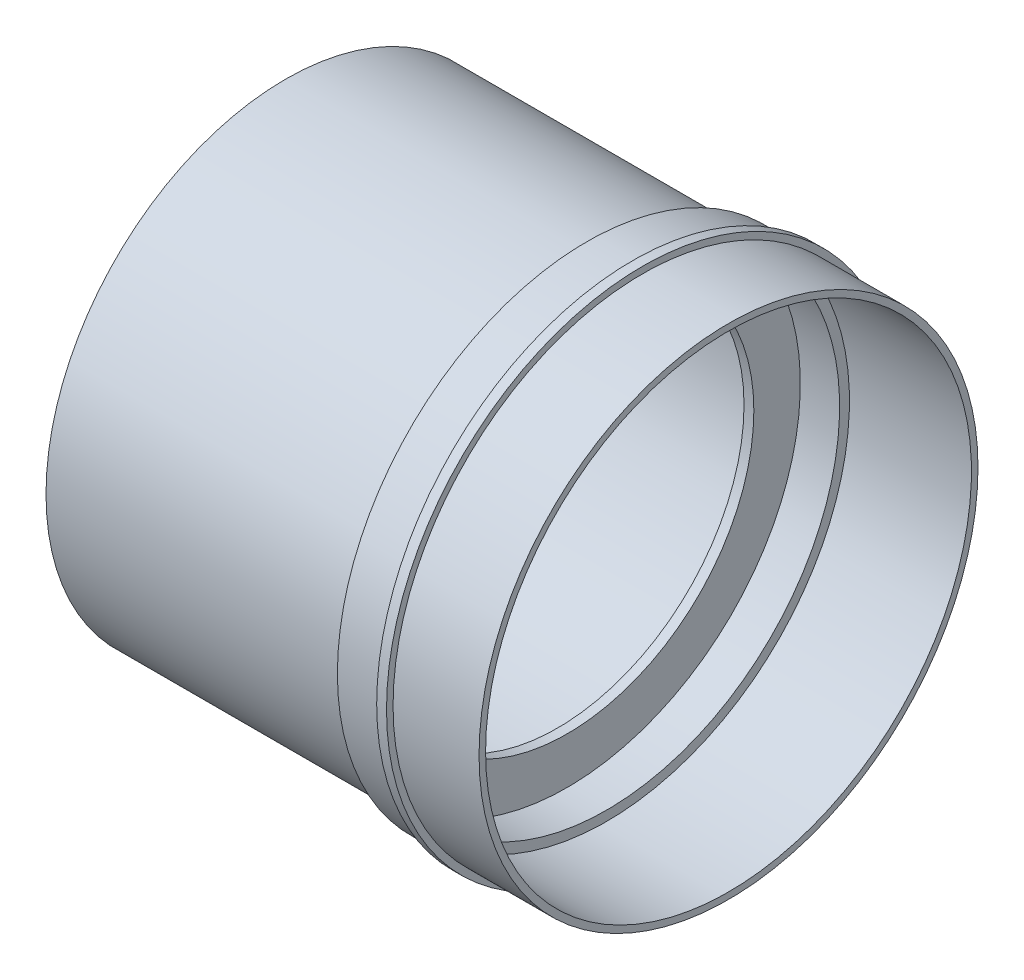
ISO-10303-21;
HEADER;
FILE_DESCRIPTION(('STEP AP214'),'2;1');
FILE_NAME('part.step','',(''),(''),'','','');
FILE_SCHEMA(('AUTOMOTIVE_DESIGN { 1 0 10303 214 1 1 1 1 }'));
ENDSEC;
DATA;
#1=APPLICATION_CONTEXT('core data for automotive mechanical design processes');
#2=APPLICATION_PROTOCOL_DEFINITION('international standard','automotive_design',2000,#1);
#3=PRODUCT_CONTEXT('',#1,'mechanical');
#4=PRODUCT('Part','Part','',(#3));
#5=PRODUCT_RELATED_PRODUCT_CATEGORY('part','',(#4));
#6=PRODUCT_DEFINITION_FORMATION('','',#4);
#7=PRODUCT_DEFINITION_CONTEXT('part definition',#1,'design');
#8=PRODUCT_DEFINITION('design','',#6,#7);
#9=PRODUCT_DEFINITION_SHAPE('','',#8);
#10=(LENGTH_UNIT() NAMED_UNIT(*) SI_UNIT(.MILLI.,.METRE.));
#11=(NAMED_UNIT(*) PLANE_ANGLE_UNIT() SI_UNIT($,.RADIAN.));
#12=(NAMED_UNIT(*) SI_UNIT($,.STERADIAN.) SOLID_ANGLE_UNIT());
#13=UNCERTAINTY_MEASURE_WITH_UNIT(LENGTH_MEASURE(1.E-05),#10,'distance_accuracy_value','');
#14=(GEOMETRIC_REPRESENTATION_CONTEXT(3) GLOBAL_UNCERTAINTY_ASSIGNED_CONTEXT((#13)) GLOBAL_UNIT_ASSIGNED_CONTEXT((#10,
#11,#12)) REPRESENTATION_CONTEXT('',''));
#15=CARTESIAN_POINT('',(0.,0.,0.));
#16=DIRECTION('',(0.,0.,1.));
#17=DIRECTION('',(1.,0.,0.));
#18=AXIS2_PLACEMENT_3D('',#15,#16,#17);
#19=CARTESIAN_POINT('',(-83.,73.2,0.));
#20=DIRECTION('',(1.,0.,0.));
#21=DIRECTION('',(0.,0.,-1.));
#22=AXIS2_PLACEMENT_3D('',#19,#20,#21);
#23=PLANE('',#22);
#24=CARTESIAN_POINT('',(-83.,0.,0.));
#25=DIRECTION('',(-1.,0.,0.));
#26=DIRECTION('',(0.,0.,1.));
#27=AXIS2_PLACEMENT_3D('',#24,#25,#26);
#28=CIRCLE('',#27,71.2);
#29=CARTESIAN_POINT('',(-83.,0.,71.2));
#30=VERTEX_POINT('',#29);
#31=EDGE_CURVE('E10',#30,#30,#28,.T.);
#32=ORIENTED_EDGE('',*,*,#31,.F.);
#33=EDGE_LOOP('',(#32));
#34=FACE_BOUND('',#33,.T.);
#35=CARTESIAN_POINT('',(-83.,0.,0.));
#36=DIRECTION('',(-1.,0.,0.));
#37=DIRECTION('',(0.,0.,1.));
#38=AXIS2_PLACEMENT_3D('',#35,#36,#37);
#39=CIRCLE('',#38,73.2);
#40=CARTESIAN_POINT('',(-83.,0.,73.2));
#41=VERTEX_POINT('',#40);
#42=EDGE_CURVE('E87',#41,#41,#39,.T.);
#43=ORIENTED_EDGE('',*,*,#42,.T.);
#44=EDGE_LOOP('',(#43));
#45=FACE_BOUND('',#44,.T.);
#46=ADVANCED_FACE('F35',(#34,#45),#23,.F.);
#47=CARTESIAN_POINT('',(-34.473771286316,0.,0.));
#48=DIRECTION('',(-1.,0.,0.));
#49=DIRECTION('',(0.,0.,1.));
#50=AXIS2_PLACEMENT_3D('',#47,#48,#49);
#51=CYLINDRICAL_SURFACE('',#50,71.2);
#52=CARTESIAN_POINT('',(0.,0.,0.));
#53=DIRECTION('',(-1.,0.,0.));
#54=DIRECTION('',(0.,0.,1.));
#55=AXIS2_PLACEMENT_3D('',#52,#53,#54);
#56=CIRCLE('',#55,71.2);
#57=CARTESIAN_POINT('',(0.,0.,71.2));
#58=VERTEX_POINT('',#57);
#59=EDGE_CURVE('E41',#58,#58,#56,.T.);
#60=ORIENTED_EDGE('',*,*,#59,.F.);
#61=EDGE_LOOP('',(#60));
#62=FACE_BOUND('',#61,.T.);
#63=ORIENTED_EDGE('',*,*,#31,.T.);
#64=EDGE_LOOP('',(#63));
#65=FACE_BOUND('',#64,.T.);
#66=ADVANCED_FACE('F172',(#62,#65),#51,.F.);
#67=CARTESIAN_POINT('',(0.,71.2,0.));
#68=DIRECTION('',(1.,0.,0.));
#69=DIRECTION('',(0.,0.,-1.));
#70=AXIS2_PLACEMENT_3D('',#67,#68,#69);
#71=PLANE('',#70);
#72=CARTESIAN_POINT('',(0.,0.,0.));
#73=DIRECTION('',(-1.,0.,0.));
#74=DIRECTION('',(0.,0.,1.));
#75=AXIS2_PLACEMENT_3D('',#72,#73,#74);
#76=CIRCLE('',#75,57.);
#77=CARTESIAN_POINT('',(0.,0.,57.));
#78=VERTEX_POINT('',#77);
#79=EDGE_CURVE('E45',#78,#78,#76,.T.);
#80=ORIENTED_EDGE('',*,*,#79,.F.);
#81=EDGE_LOOP('',(#80));
#82=FACE_BOUND('',#81,.T.);
#83=ORIENTED_EDGE('',*,*,#59,.T.);
#84=EDGE_LOOP('',(#83));
#85=FACE_BOUND('',#84,.T.);
#86=ADVANCED_FACE('F167',(#82,#85),#71,.F.);
#87=CARTESIAN_POINT('',(-34.473771286316,0.,0.));
#88=DIRECTION('',(-1.,0.,0.));
#89=DIRECTION('',(0.,0.,1.));
#90=AXIS2_PLACEMENT_3D('',#87,#88,#89);
#91=CYLINDRICAL_SURFACE('',#90,57.);
#92=CARTESIAN_POINT('',(3.,0.,0.));
#93=DIRECTION('',(-1.,0.,0.));
#94=DIRECTION('',(0.,0.,1.));
#95=AXIS2_PLACEMENT_3D('',#92,#93,#94);
#96=CIRCLE('',#95,57.);
#97=CARTESIAN_POINT('',(3.,0.,57.));
#98=VERTEX_POINT('',#97);
#99=EDGE_CURVE('E49',#98,#98,#96,.T.);
#100=ORIENTED_EDGE('',*,*,#99,.F.);
#101=EDGE_LOOP('',(#100));
#102=FACE_BOUND('',#101,.T.);
#103=ORIENTED_EDGE('',*,*,#79,.T.);
#104=EDGE_LOOP('',(#103));
#105=FACE_BOUND('',#104,.T.);
#106=ADVANCED_FACE('F161',(#102,#105),#91,.F.);
#107=CARTESIAN_POINT('',(2.99999999999999,71.2,0.));
#108=DIRECTION('',(-1.,0.,0.));
#109=DIRECTION('',(0.,0.,1.));
#110=AXIS2_PLACEMENT_3D('',#107,#108,#109);
#111=PLANE('',#110);
#112=CARTESIAN_POINT('',(2.99999999999999,0.,0.));
#113=DIRECTION('',(-1.,0.,0.));
#114=DIRECTION('',(0.,0.,1.));
#115=AXIS2_PLACEMENT_3D('',#112,#113,#114);
#116=CIRCLE('',#115,71.2);
#117=CARTESIAN_POINT('',(2.99999999999999,0.,71.2));
#118=VERTEX_POINT('',#117);
#119=EDGE_CURVE('E54',#118,#118,#116,.T.);
#120=ORIENTED_EDGE('',*,*,#119,.F.);
#121=EDGE_LOOP('',(#120));
#122=FACE_BOUND('',#121,.T.);
#123=ORIENTED_EDGE('',*,*,#99,.T.);
#124=EDGE_LOOP('',(#123));
#125=FACE_BOUND('',#124,.T.);
#126=ADVANCED_FACE('F155',(#122,#125),#111,.F.);
#127=CARTESIAN_POINT('',(-34.473771286316,0.,0.));
#128=DIRECTION('',(-1.,0.,0.));
#129=DIRECTION('',(0.,0.,1.));
#130=AXIS2_PLACEMENT_3D('',#127,#128,#129);
#131=CYLINDRICAL_SURFACE('',#130,71.2);
#132=CARTESIAN_POINT('',(15.,0.,0.));
#133=DIRECTION('',(-1.,0.,0.));
#134=DIRECTION('',(0.,0.,1.));
#135=AXIS2_PLACEMENT_3D('',#132,#133,#134);
#136=CIRCLE('',#135,71.2);
#137=CARTESIAN_POINT('',(15.,0.,71.2));
#138=VERTEX_POINT('',#137);
#139=EDGE_CURVE('E57',#138,#138,#136,.T.);
#140=ORIENTED_EDGE('',*,*,#139,.F.);
#141=EDGE_LOOP('',(#140));
#142=FACE_BOUND('',#141,.T.);
#143=ORIENTED_EDGE('',*,*,#119,.T.);
#144=EDGE_LOOP('',(#143));
#145=FACE_BOUND('',#144,.T.);
#146=ADVANCED_FACE('F149',(#142,#145),#131,.F.);
#147=CARTESIAN_POINT('',(15.,74.2,0.));
#148=DIRECTION('',(-1.,0.,0.));
#149=DIRECTION('',(0.,0.,1.));
#150=AXIS2_PLACEMENT_3D('',#147,#148,#149);
#151=PLANE('',#150);
#152=CARTESIAN_POINT('',(15.,0.,0.));
#153=DIRECTION('',(-1.,0.,0.));
#154=DIRECTION('',(0.,0.,1.));
#155=AXIS2_PLACEMENT_3D('',#152,#153,#154);
#156=CIRCLE('',#155,74.2);
#157=CARTESIAN_POINT('',(15.,0.,74.2));
#158=VERTEX_POINT('',#157);
#159=EDGE_CURVE('E60',#158,#158,#156,.T.);
#160=ORIENTED_EDGE('',*,*,#159,.F.);
#161=EDGE_LOOP('',(#160));
#162=FACE_BOUND('',#161,.T.);
#163=ORIENTED_EDGE('',*,*,#139,.T.);
#164=EDGE_LOOP('',(#163));
#165=FACE_BOUND('',#164,.T.);
#166=ADVANCED_FACE('F143',(#162,#165),#151,.F.);
#167=CARTESIAN_POINT('',(-34.473771286316,0.,0.));
#168=DIRECTION('',(-1.,0.,0.));
#169=DIRECTION('',(0.,0.,1.));
#170=AXIS2_PLACEMENT_3D('',#167,#168,#169);
#171=CYLINDRICAL_SURFACE('',#170,74.2);
#172=CARTESIAN_POINT('',(52.2635418509648,0.,0.));
#173=DIRECTION('',(-1.,0.,0.));
#174=DIRECTION('',(0.,0.,1.));
#175=AXIS2_PLACEMENT_3D('',#172,#173,#174);
#176=CIRCLE('',#175,74.2);
#177=CARTESIAN_POINT('',(52.2635418509648,0.,74.2));
#178=VERTEX_POINT('',#177);
#179=EDGE_CURVE('E63',#178,#178,#176,.T.);
#180=ORIENTED_EDGE('',*,*,#179,.F.);
#181=EDGE_LOOP('',(#180));
#182=FACE_BOUND('',#181,.T.);
#183=ORIENTED_EDGE('',*,*,#159,.T.);
#184=EDGE_LOOP('',(#183));
#185=FACE_BOUND('',#184,.T.);
#186=ADVANCED_FACE('F137',(#182,#185),#171,.F.);
#187=CARTESIAN_POINT('',(52.2635418509648,74.2,0.));
#188=DIRECTION('',(-1.,0.,0.));
#189=DIRECTION('',(0.,0.,1.));
#190=AXIS2_PLACEMENT_3D('',#187,#188,#189);
#191=PLANE('',#190);
#192=CARTESIAN_POINT('',(52.2635418509648,0.,0.));
#193=DIRECTION('',(-1.,0.,0.));
#194=DIRECTION('',(0.,0.,1.));
#195=AXIS2_PLACEMENT_3D('',#192,#193,#194);
#196=CIRCLE('',#195,76.2);
#197=CARTESIAN_POINT('',(52.2635418509648,0.,76.2));
#198=VERTEX_POINT('',#197);
#199=EDGE_CURVE('E66',#198,#198,#196,.T.);
#200=ORIENTED_EDGE('',*,*,#199,.F.);
#201=EDGE_LOOP('',(#200));
#202=FACE_BOUND('',#201,.T.);
#203=ORIENTED_EDGE('',*,*,#179,.T.);
#204=EDGE_LOOP('',(#203));
#205=FACE_BOUND('',#204,.T.);
#206=ADVANCED_FACE('F131',(#202,#205),#191,.F.);
#207=CARTESIAN_POINT('',(-34.473771286316,0.,0.));
#208=DIRECTION('',(-1.,0.,0.));
#209=DIRECTION('',(0.,0.,1.));
#210=AXIS2_PLACEMENT_3D('',#207,#208,#209);
#211=CYLINDRICAL_SURFACE('',#210,76.2);
#212=CARTESIAN_POINT('',(26.,0.,0.));
#213=DIRECTION('',(-1.,0.,0.));
#214=DIRECTION('',(0.,0.,1.));
#215=AXIS2_PLACEMENT_3D('',#212,#213,#214);
#216=CIRCLE('',#215,76.2);
#217=CARTESIAN_POINT('',(26.,0.,76.2));
#218=VERTEX_POINT('',#217);
#219=EDGE_CURVE('E69',#218,#218,#216,.T.);
#220=ORIENTED_EDGE('',*,*,#219,.F.);
#221=EDGE_LOOP('',(#220));
#222=FACE_BOUND('',#221,.T.);
#223=ORIENTED_EDGE('',*,*,#199,.T.);
#224=EDGE_LOOP('',(#223));
#225=FACE_BOUND('',#224,.T.);
#226=ADVANCED_FACE('F125',(#222,#225),#211,.T.);
#227=CARTESIAN_POINT('',(26.,76.2,0.));
#228=DIRECTION('',(-1.,0.,0.));
#229=DIRECTION('',(0.,0.,1.));
#230=AXIS2_PLACEMENT_3D('',#227,#228,#229);
#231=PLANE('',#230);
#232=CARTESIAN_POINT('',(26.,0.,0.));
#233=DIRECTION('',(-1.,0.,0.));
#234=DIRECTION('',(0.,0.,1.));
#235=AXIS2_PLACEMENT_3D('',#232,#233,#234);
#236=CIRCLE('',#235,78.2);
#237=CARTESIAN_POINT('',(26.,0.,78.2));
#238=VERTEX_POINT('',#237);
#239=EDGE_CURVE('E72',#238,#238,#236,.T.);
#240=ORIENTED_EDGE('',*,*,#239,.F.);
#241=EDGE_LOOP('',(#240));
#242=FACE_BOUND('',#241,.T.);
#243=ORIENTED_EDGE('',*,*,#219,.T.);
#244=EDGE_LOOP('',(#243));
#245=FACE_BOUND('',#244,.T.);
#246=ADVANCED_FACE('F119',(#242,#245),#231,.F.);
#247=CARTESIAN_POINT('',(-34.473771286316,0.,0.));
#248=DIRECTION('',(-1.,0.,0.));
#249=DIRECTION('',(0.,0.,1.));
#250=AXIS2_PLACEMENT_3D('',#247,#248,#249);
#251=CYLINDRICAL_SURFACE('',#250,78.2);
#252=CARTESIAN_POINT('',(23.,0.,0.));
#253=DIRECTION('',(-1.,0.,0.));
#254=DIRECTION('',(0.,0.,1.));
#255=AXIS2_PLACEMENT_3D('',#252,#253,#254);
#256=CIRCLE('',#255,78.2);
#257=CARTESIAN_POINT('',(23.,0.,78.2));
#258=VERTEX_POINT('',#257);
#259=EDGE_CURVE('E75',#258,#258,#256,.T.);
#260=ORIENTED_EDGE('',*,*,#259,.F.);
#261=EDGE_LOOP('',(#260));
#262=FACE_BOUND('',#261,.T.);
#263=ORIENTED_EDGE('',*,*,#239,.T.);
#264=EDGE_LOOP('',(#263));
#265=FACE_BOUND('',#264,.T.);
#266=ADVANCED_FACE('F113',(#262,#265),#251,.T.);
#267=CARTESIAN_POINT('',(23.,76.2,0.));
#268=DIRECTION('',(1.,0.,0.));
#269=DIRECTION('',(0.,0.,-1.));
#270=AXIS2_PLACEMENT_3D('',#267,#268,#269);
#271=PLANE('',#270);
#272=CARTESIAN_POINT('',(23.,0.,0.));
#273=DIRECTION('',(-1.,0.,0.));
#274=DIRECTION('',(0.,0.,1.));
#275=AXIS2_PLACEMENT_3D('',#272,#273,#274);
#276=CIRCLE('',#275,76.2);
#277=CARTESIAN_POINT('',(23.,0.,76.2));
#278=VERTEX_POINT('',#277);
#279=EDGE_CURVE('E78',#278,#278,#276,.T.);
#280=ORIENTED_EDGE('',*,*,#279,.F.);
#281=EDGE_LOOP('',(#280));
#282=FACE_BOUND('',#281,.T.);
#283=ORIENTED_EDGE('',*,*,#259,.T.);
#284=EDGE_LOOP('',(#283));
#285=FACE_BOUND('',#284,.T.);
#286=ADVANCED_FACE('F107',(#282,#285),#271,.F.);
#287=CARTESIAN_POINT('',(-34.473771286316,0.,0.));
#288=DIRECTION('',(-1.,0.,0.));
#289=DIRECTION('',(0.,0.,1.));
#290=AXIS2_PLACEMENT_3D('',#287,#288,#289);
#291=CYLINDRICAL_SURFACE('',#290,76.2);
#292=CARTESIAN_POINT('',(8.99999999999999,0.,0.));
#293=DIRECTION('',(-1.,0.,0.));
#294=DIRECTION('',(0.,0.,1.));
#295=AXIS2_PLACEMENT_3D('',#292,#293,#294);
#296=CIRCLE('',#295,76.2);
#297=CARTESIAN_POINT('',(8.99999999999999,0.,76.2));
#298=VERTEX_POINT('',#297);
#299=EDGE_CURVE('E81',#298,#298,#296,.T.);
#300=ORIENTED_EDGE('',*,*,#299,.F.);
#301=EDGE_LOOP('',(#300));
#302=FACE_BOUND('',#301,.T.);
#303=ORIENTED_EDGE('',*,*,#279,.T.);
#304=EDGE_LOOP('',(#303));
#305=FACE_BOUND('',#304,.T.);
#306=ADVANCED_FACE('F101',(#302,#305),#291,.T.);
#307=CARTESIAN_POINT('',(8.99999999999999,73.2,0.));
#308=DIRECTION('',(1.,0.,0.));
#309=DIRECTION('',(0.,0.,-1.));
#310=AXIS2_PLACEMENT_3D('',#307,#308,#309);
#311=PLANE('',#310);
#312=CARTESIAN_POINT('',(8.99999999999999,0.,0.));
#313=DIRECTION('',(-1.,0.,0.));
#314=DIRECTION('',(0.,0.,1.));
#315=AXIS2_PLACEMENT_3D('',#312,#313,#314);
#316=CIRCLE('',#315,73.2);
#317=CARTESIAN_POINT('',(8.99999999999999,0.,73.2));
#318=VERTEX_POINT('',#317);
#319=EDGE_CURVE('E84',#318,#318,#316,.T.);
#320=ORIENTED_EDGE('',*,*,#319,.F.);
#321=EDGE_LOOP('',(#320));
#322=FACE_BOUND('',#321,.T.);
#323=ORIENTED_EDGE('',*,*,#299,.T.);
#324=EDGE_LOOP('',(#323));
#325=FACE_BOUND('',#324,.T.);
#326=ADVANCED_FACE('F95',(#322,#325),#311,.F.);
#327=CARTESIAN_POINT('',(-34.473771286316,0.,0.));
#328=DIRECTION('',(-1.,0.,0.));
#329=DIRECTION('',(0.,0.,1.));
#330=AXIS2_PLACEMENT_3D('',#327,#328,#329);
#331=CYLINDRICAL_SURFACE('',#330,73.2);
#332=ORIENTED_EDGE('',*,*,#42,.F.);
#333=EDGE_LOOP('',(#332));
#334=FACE_BOUND('',#333,.T.);
#335=ORIENTED_EDGE('',*,*,#319,.T.);
#336=EDGE_LOOP('',(#335));
#337=FACE_BOUND('',#336,.T.);
#338=ADVANCED_FACE('F92',(#334,#337),#331,.T.);
#339=CLOSED_SHELL('',(#46,#66,#86,#106,#126,#146,#166,#186,#206,#226,#246,#266,#286,#306,#326,#338));
#340=MANIFOLD_SOLID_BREP('B2',#339);
#341=ADVANCED_BREP_SHAPE_REPRESENTATION('',(#18,#340),#14);
#342=SHAPE_DEFINITION_REPRESENTATION(#9,#341);
ENDSEC;
END-ISO-10303-21;
